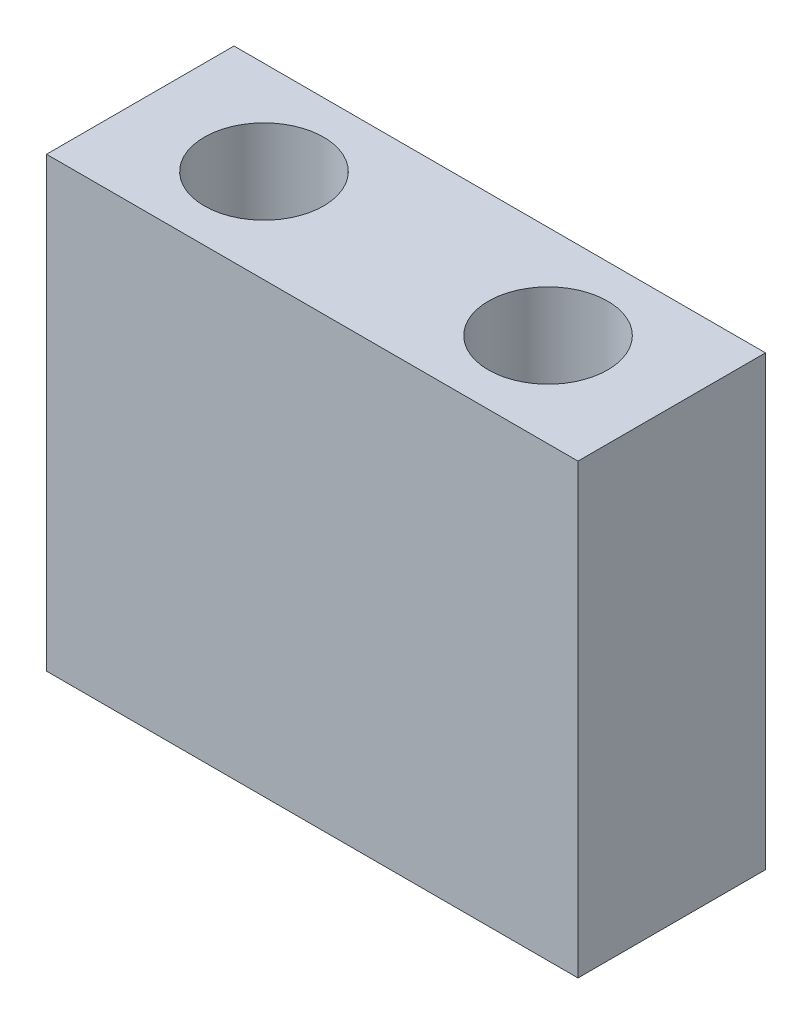
ISO-10303-21;
HEADER;
FILE_DESCRIPTION(('STEP AP214'),'2;1');
FILE_NAME('part.step','',(''),(''),'','','');
FILE_SCHEMA(('AUTOMOTIVE_DESIGN { 1 0 10303 214 1 1 1 1 }'));
ENDSEC;
DATA;
#1=APPLICATION_CONTEXT('core data for automotive mechanical design processes');
#2=APPLICATION_PROTOCOL_DEFINITION('international standard','automotive_design',2000,#1);
#3=PRODUCT_CONTEXT('',#1,'mechanical');
#4=PRODUCT('Part','Part','',(#3));
#5=PRODUCT_RELATED_PRODUCT_CATEGORY('part','',(#4));
#6=PRODUCT_DEFINITION_FORMATION('','',#4);
#7=PRODUCT_DEFINITION_CONTEXT('part definition',#1,'design');
#8=PRODUCT_DEFINITION('design','',#6,#7);
#9=PRODUCT_DEFINITION_SHAPE('','',#8);
#10=(LENGTH_UNIT() NAMED_UNIT(*) SI_UNIT(.MILLI.,.METRE.));
#11=(NAMED_UNIT(*) PLANE_ANGLE_UNIT() SI_UNIT($,.RADIAN.));
#12=(NAMED_UNIT(*) SI_UNIT($,.STERADIAN.) SOLID_ANGLE_UNIT());
#13=UNCERTAINTY_MEASURE_WITH_UNIT(LENGTH_MEASURE(1.E-05),#10,'distance_accuracy_value','');
#14=(GEOMETRIC_REPRESENTATION_CONTEXT(3) GLOBAL_UNCERTAINTY_ASSIGNED_CONTEXT((#13)) GLOBAL_UNIT_ASSIGNED_CONTEXT((#10,
#11,#12)) REPRESENTATION_CONTEXT('',''));
#15=CARTESIAN_POINT('',(0.,0.,0.));
#16=DIRECTION('',(0.,0.,1.));
#17=DIRECTION('',(1.,0.,0.));
#18=AXIS2_PLACEMENT_3D('',#15,#16,#17);
#19=CARTESIAN_POINT('',(9.355,15.76,-3.3));
#20=DIRECTION('',(-1.,0.,0.));
#21=DIRECTION('',(0.,0.,1.));
#22=AXIS2_PLACEMENT_3D('',#19,#20,#21);
#23=PLANE('',#22);
#24=DIRECTION('',(0.,0.,-1.));
#25=VECTOR('',#24,1.);
#26=CARTESIAN_POINT('',(9.355,0.,-3.3));
#27=LINE('',#26,#25);
#28=CARTESIAN_POINT('',(9.355,0.,3.3));
#29=VERTEX_POINT('',#28);
#30=CARTESIAN_POINT('',(9.355,0.,-3.3));
#31=VERTEX_POINT('',#30);
#32=EDGE_CURVE('E116',#29,#31,#27,.T.);
#33=ORIENTED_EDGE('',*,*,#32,.T.);
#34=DIRECTION('',(0.,-1.,0.));
#35=VECTOR('',#34,1.);
#36=CARTESIAN_POINT('',(9.355,15.76,-3.3));
#37=LINE('',#36,#35);
#38=CARTESIAN_POINT('',(9.355,15.76,-3.3));
#39=VERTEX_POINT('',#38);
#40=EDGE_CURVE('E11',#39,#31,#37,.T.);
#41=ORIENTED_EDGE('',*,*,#40,.F.);
#42=DIRECTION('',(0.,0.,-1.));
#43=VECTOR('',#42,1.);
#44=CARTESIAN_POINT('',(9.355,15.76,-3.3));
#45=LINE('',#44,#43);
#46=CARTESIAN_POINT('',(9.355,15.76,3.3));
#47=VERTEX_POINT('',#46);
#48=EDGE_CURVE('E100',#47,#39,#45,.T.);
#49=ORIENTED_EDGE('',*,*,#48,.F.);
#50=DIRECTION('',(0.,-1.,0.));
#51=VECTOR('',#50,1.);
#52=CARTESIAN_POINT('',(9.355,15.76,3.3));
#53=LINE('',#52,#51);
#54=EDGE_CURVE('E112',#47,#29,#53,.T.);
#55=ORIENTED_EDGE('',*,*,#54,.T.);
#56=EDGE_LOOP('',(#33,#41,#49,#55));
#57=FACE_BOUND('',#56,.T.);
#58=ADVANCED_FACE('F48',(#57),#23,.F.);
#59=CARTESIAN_POINT('',(-9.355,15.76,-3.3));
#60=DIRECTION('',(0.,0.,1.));
#61=DIRECTION('',(1.,0.,0.));
#62=AXIS2_PLACEMENT_3D('',#59,#60,#61);
#63=PLANE('',#62);
#64=DIRECTION('',(-1.,0.,0.));
#65=VECTOR('',#64,1.);
#66=CARTESIAN_POINT('',(-9.355,0.,-3.3));
#67=LINE('',#66,#65);
#68=CARTESIAN_POINT('',(-9.355,0.,-3.3));
#69=VERTEX_POINT('',#68);
#70=EDGE_CURVE('E105',#31,#69,#67,.T.);
#71=ORIENTED_EDGE('',*,*,#70,.T.);
#72=DIRECTION('',(0.,-1.,0.));
#73=VECTOR('',#72,1.);
#74=CARTESIAN_POINT('',(-9.355,15.76,-3.3));
#75=LINE('',#74,#73);
#76=CARTESIAN_POINT('',(-9.355,15.76,-3.3));
#77=VERTEX_POINT('',#76);
#78=EDGE_CURVE('E57',#77,#69,#75,.T.);
#79=ORIENTED_EDGE('',*,*,#78,.F.);
#80=DIRECTION('',(-1.,0.,0.));
#81=VECTOR('',#80,1.);
#82=CARTESIAN_POINT('',(-9.355,15.76,-3.3));
#83=LINE('',#82,#81);
#84=EDGE_CURVE('E95',#39,#77,#83,.T.);
#85=ORIENTED_EDGE('',*,*,#84,.F.);
#86=ORIENTED_EDGE('',*,*,#40,.T.);
#87=EDGE_LOOP('',(#71,#79,#85,#86));
#88=FACE_BOUND('',#87,.T.);
#89=ADVANCED_FACE('F104',(#88),#63,.F.);
#90=CARTESIAN_POINT('',(-9.355,15.76,-3.3));
#91=DIRECTION('',(1.,0.,0.));
#92=DIRECTION('',(0.,0.,-1.));
#93=AXIS2_PLACEMENT_3D('',#90,#91,#92);
#94=PLANE('',#93);
#95=DIRECTION('',(0.,0.,1.));
#96=VECTOR('',#95,1.);
#97=CARTESIAN_POINT('',(-9.355,0.,-3.3));
#98=LINE('',#97,#96);
#99=CARTESIAN_POINT('',(-9.355,0.,3.3));
#100=VERTEX_POINT('',#99);
#101=EDGE_CURVE('E82',#69,#100,#98,.T.);
#102=ORIENTED_EDGE('',*,*,#101,.T.);
#103=DIRECTION('',(0.,-1.,0.));
#104=VECTOR('',#103,1.);
#105=CARTESIAN_POINT('',(-9.355,15.76,3.3));
#106=LINE('',#105,#104);
#107=CARTESIAN_POINT('',(-9.355,15.76,3.3));
#108=VERTEX_POINT('',#107);
#109=EDGE_CURVE('E107',#108,#100,#106,.T.);
#110=ORIENTED_EDGE('',*,*,#109,.F.);
#111=DIRECTION('',(0.,0.,1.));
#112=VECTOR('',#111,1.);
#113=CARTESIAN_POINT('',(-9.355,15.76,-3.3));
#114=LINE('',#113,#112);
#115=EDGE_CURVE('E98',#77,#108,#114,.T.);
#116=ORIENTED_EDGE('',*,*,#115,.F.);
#117=ORIENTED_EDGE('',*,*,#78,.T.);
#118=EDGE_LOOP('',(#102,#110,#116,#117));
#119=FACE_BOUND('',#118,.T.);
#120=ADVANCED_FACE('F108',(#119),#94,.F.);
#121=CARTESIAN_POINT('',(-9.355,15.76,3.3));
#122=DIRECTION('',(0.,0.,-1.));
#123=DIRECTION('',(-1.,0.,0.));
#124=AXIS2_PLACEMENT_3D('',#121,#122,#123);
#125=PLANE('',#124);
#126=DIRECTION('',(1.,0.,0.));
#127=VECTOR('',#126,1.);
#128=CARTESIAN_POINT('',(-9.355,0.,3.3));
#129=LINE('',#128,#127);
#130=EDGE_CURVE('E88',#100,#29,#129,.T.);
#131=ORIENTED_EDGE('',*,*,#130,.T.);
#132=ORIENTED_EDGE('',*,*,#54,.F.);
#133=DIRECTION('',(1.,0.,0.));
#134=VECTOR('',#133,1.);
#135=CARTESIAN_POINT('',(-9.355,15.76,3.3));
#136=LINE('',#135,#134);
#137=EDGE_CURVE('E65',#108,#47,#136,.T.);
#138=ORIENTED_EDGE('',*,*,#137,.F.);
#139=ORIENTED_EDGE('',*,*,#109,.T.);
#140=EDGE_LOOP('',(#131,#132,#138,#139));
#141=FACE_BOUND('',#140,.T.);
#142=ADVANCED_FACE('F130',(#141),#125,.F.);
#143=CARTESIAN_POINT('',(0.,15.76,0.));
#144=DIRECTION('',(0.,1.,0.));
#145=DIRECTION('',(0.,0.,1.));
#146=AXIS2_PLACEMENT_3D('',#143,#144,#145);
#147=PLANE('',#146);
#148=CARTESIAN_POINT('',(5.,15.76,0.));
#149=DIRECTION('',(0.,1.,0.));
#150=DIRECTION('',(0.,0.,1.));
#151=AXIS2_PLACEMENT_3D('',#148,#149,#150);
#152=CIRCLE('',#151,2.1);
#153=CARTESIAN_POINT('',(5.,15.76,2.1));
#154=VERTEX_POINT('',#153);
#155=EDGE_CURVE('E148',#154,#154,#152,.T.);
#156=ORIENTED_EDGE('',*,*,#155,.F.);
#157=EDGE_LOOP('',(#156));
#158=FACE_BOUND('',#157,.T.);
#159=CARTESIAN_POINT('',(-5.,15.76,0.));
#160=DIRECTION('',(0.,1.,0.));
#161=DIRECTION('',(0.,0.,1.));
#162=AXIS2_PLACEMENT_3D('',#159,#160,#161);
#163=CIRCLE('',#162,2.1);
#164=CARTESIAN_POINT('',(-5.,15.76,2.1));
#165=VERTEX_POINT('',#164);
#166=EDGE_CURVE('E140',#165,#165,#163,.T.);
#167=ORIENTED_EDGE('',*,*,#166,.F.);
#168=EDGE_LOOP('',(#167));
#169=FACE_BOUND('',#168,.T.);
#170=ORIENTED_EDGE('',*,*,#48,.T.);
#171=ORIENTED_EDGE('',*,*,#84,.T.);
#172=ORIENTED_EDGE('',*,*,#115,.T.);
#173=ORIENTED_EDGE('',*,*,#137,.T.);
#174=EDGE_LOOP('',(#170,#171,#172,#173));
#175=FACE_BOUND('',#174,.T.);
#176=ADVANCED_FACE('F96',(#158,#169,#175),#147,.T.);
#177=CARTESIAN_POINT('',(0.,0.,0.));
#178=DIRECTION('',(0.,1.,0.));
#179=DIRECTION('',(0.,0.,1.));
#180=AXIS2_PLACEMENT_3D('',#177,#178,#179);
#181=PLANE('',#180);
#182=CARTESIAN_POINT('',(5.,0.,0.));
#183=DIRECTION('',(0.,1.,0.));
#184=DIRECTION('',(0.,0.,1.));
#185=AXIS2_PLACEMENT_3D('',#182,#183,#184);
#186=CIRCLE('',#185,2.1);
#187=CARTESIAN_POINT('',(5.,0.,2.1));
#188=VERTEX_POINT('',#187);
#189=EDGE_CURVE('E144',#188,#188,#186,.T.);
#190=ORIENTED_EDGE('',*,*,#189,.T.);
#191=EDGE_LOOP('',(#190));
#192=FACE_BOUND('',#191,.T.);
#193=CARTESIAN_POINT('',(-5.,0.,0.));
#194=DIRECTION('',(0.,1.,0.));
#195=DIRECTION('',(0.,0.,1.));
#196=AXIS2_PLACEMENT_3D('',#193,#194,#195);
#197=CIRCLE('',#196,2.1);
#198=CARTESIAN_POINT('',(-5.,0.,2.1));
#199=VERTEX_POINT('',#198);
#200=EDGE_CURVE('E120',#199,#199,#197,.T.);
#201=ORIENTED_EDGE('',*,*,#200,.T.);
#202=EDGE_LOOP('',(#201));
#203=FACE_BOUND('',#202,.T.);
#204=ORIENTED_EDGE('',*,*,#32,.F.);
#205=ORIENTED_EDGE('',*,*,#130,.F.);
#206=ORIENTED_EDGE('',*,*,#101,.F.);
#207=ORIENTED_EDGE('',*,*,#70,.F.);
#208=EDGE_LOOP('',(#204,#205,#206,#207));
#209=FACE_BOUND('',#208,.T.);
#210=ADVANCED_FACE('F133',(#192,#203,#209),#181,.F.);
#211=CARTESIAN_POINT('',(-5.,15.76,0.));
#212=DIRECTION('',(0.,1.,0.));
#213=DIRECTION('',(0.,0.,1.));
#214=AXIS2_PLACEMENT_3D('',#211,#212,#213);
#215=CYLINDRICAL_SURFACE('',#214,2.1);
#216=ORIENTED_EDGE('',*,*,#200,.F.);
#217=EDGE_LOOP('',(#216));
#218=FACE_BOUND('',#217,.T.);
#219=ORIENTED_EDGE('',*,*,#166,.T.);
#220=EDGE_LOOP('',(#219));
#221=FACE_BOUND('',#220,.T.);
#222=ADVANCED_FACE('F160',(#218,#221),#215,.F.);
#223=CARTESIAN_POINT('',(5.,15.76,0.));
#224=DIRECTION('',(0.,1.,0.));
#225=DIRECTION('',(0.,0.,1.));
#226=AXIS2_PLACEMENT_3D('',#223,#224,#225);
#227=CYLINDRICAL_SURFACE('',#226,2.1);
#228=ORIENTED_EDGE('',*,*,#189,.F.);
#229=EDGE_LOOP('',(#228));
#230=FACE_BOUND('',#229,.T.);
#231=ORIENTED_EDGE('',*,*,#155,.T.);
#232=EDGE_LOOP('',(#231));
#233=FACE_BOUND('',#232,.T.);
#234=ADVANCED_FACE('F153',(#230,#233),#227,.F.);
#235=CLOSED_SHELL('',(#58,#89,#120,#142,#176,#210,#222,#234));
#236=MANIFOLD_SOLID_BREP('B2',#235);
#237=ADVANCED_BREP_SHAPE_REPRESENTATION('',(#18,#236),#14);
#238=SHAPE_DEFINITION_REPRESENTATION(#9,#237);
ENDSEC;
END-ISO-10303-21;
